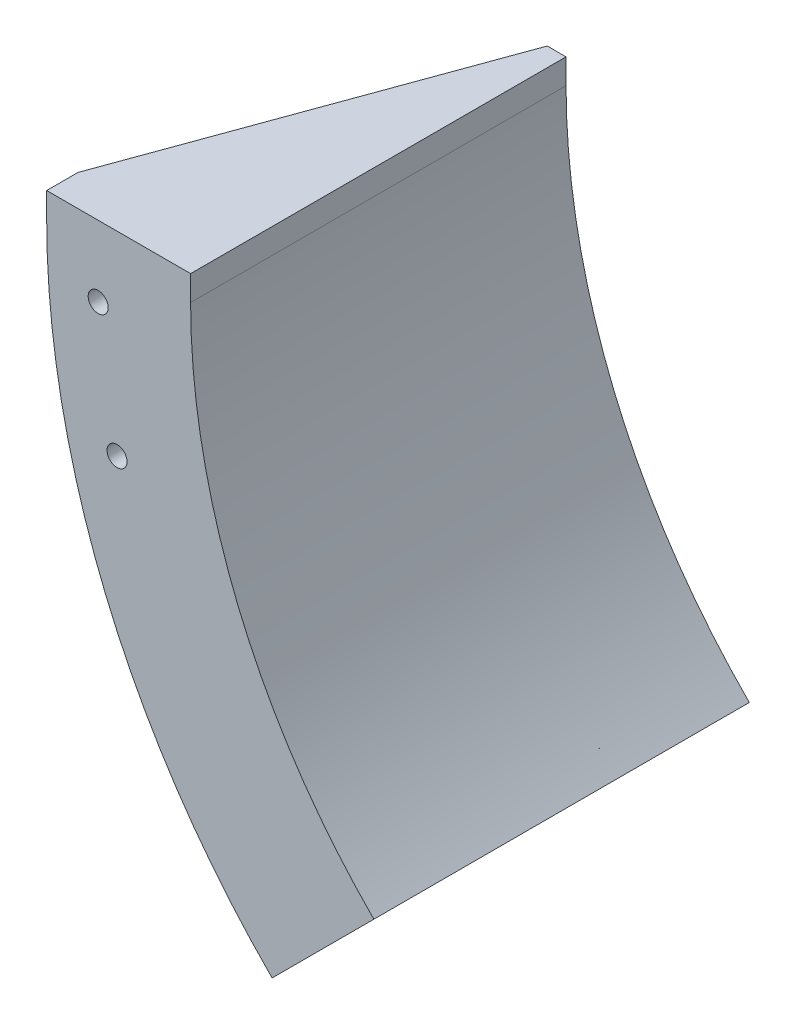
ISO-10303-21;
HEADER;
FILE_DESCRIPTION(('STEP AP214'),'2;1');
FILE_NAME('part.step','',(''),(''),'','','');
FILE_SCHEMA(('AUTOMOTIVE_DESIGN { 1 0 10303 214 1 1 1 1 }'));
ENDSEC;
DATA;
#1=APPLICATION_CONTEXT('core data for automotive mechanical design processes');
#2=APPLICATION_PROTOCOL_DEFINITION('international standard','automotive_design',2000,#1);
#3=PRODUCT_CONTEXT('',#1,'mechanical');
#4=PRODUCT('Part','Part','',(#3));
#5=PRODUCT_RELATED_PRODUCT_CATEGORY('part','',(#4));
#6=PRODUCT_DEFINITION_FORMATION('','',#4);
#7=PRODUCT_DEFINITION_CONTEXT('part definition',#1,'design');
#8=PRODUCT_DEFINITION('design','',#6,#7);
#9=PRODUCT_DEFINITION_SHAPE('','',#8);
#10=(LENGTH_UNIT() NAMED_UNIT(*) SI_UNIT(.MILLI.,.METRE.));
#11=(NAMED_UNIT(*) PLANE_ANGLE_UNIT() SI_UNIT($,.RADIAN.));
#12=(NAMED_UNIT(*) SI_UNIT($,.STERADIAN.) SOLID_ANGLE_UNIT());
#13=UNCERTAINTY_MEASURE_WITH_UNIT(LENGTH_MEASURE(1.E-05),#10,'distance_accuracy_value','');
#14=(GEOMETRIC_REPRESENTATION_CONTEXT(3) GLOBAL_UNCERTAINTY_ASSIGNED_CONTEXT((#13)) GLOBAL_UNIT_ASSIGNED_CONTEXT((#10,
#11,#12)) REPRESENTATION_CONTEXT('',''));
#15=CARTESIAN_POINT('',(0.,0.,0.));
#16=DIRECTION('',(0.,0.,1.));
#17=DIRECTION('',(1.,0.,0.));
#18=AXIS2_PLACEMENT_3D('',#15,#16,#17);
#19=CARTESIAN_POINT('',(-75.6604255869606,-70.0035713374682,0.));
#20=DIRECTION('',(-0.664534302663195,-0.664534302663195,-0.341743063086704));
#21=DIRECTION('',(0.707106781186548,-0.707106781186547,0.));
#22=AXIS2_PLACEMENT_3D('',#19,#20,#21);
#23=PLANE('',#22);
#24=DIRECTION('',(0.241648837332071,0.241648837332071,-0.939793423488437));
#25=VECTOR('',#24,1.);
#26=CARTESIAN_POINT('',(-72.8319984622144,-72.8319984622144,0.));
#27=LINE('',#26,#25);
#28=CARTESIAN_POINT('',(-86.9741340859453,-86.9741340859454,55.));
#29=VERTEX_POINT('',#28);
#30=CARTESIAN_POINT('',(-72.8319984622144,-72.8319984622144,0.));
#31=VERTEX_POINT('',#30);
#32=EDGE_CURVE('E107',#29,#31,#27,.T.);
#33=ORIENTED_EDGE('',*,*,#32,.F.);
#34=DIRECTION('',(0.707106781186548,-0.707106781186547,0.));
#35=VECTOR('',#34,1.);
#36=CARTESIAN_POINT('',(-89.8025612106915,-84.1457069611992,55.));
#37=LINE('',#36,#35);
#38=CARTESIAN_POINT('',(-89.8025612106915,-84.1457069611992,55.));
#39=VERTEX_POINT('',#38);
#40=EDGE_CURVE('E12',#39,#29,#37,.T.);
#41=ORIENTED_EDGE('',*,*,#40,.F.);
#42=DIRECTION('',(0.241648837332071,0.241648837332071,-0.939793423488437));
#43=VECTOR('',#42,1.);
#44=CARTESIAN_POINT('',(-75.6604255869606,-70.0035713374682,0.));
#45=LINE('',#44,#43);
#46=CARTESIAN_POINT('',(-75.6604255869606,-70.0035713374682,0.));
#47=VERTEX_POINT('',#46);
#48=EDGE_CURVE('E102',#39,#47,#45,.T.);
#49=ORIENTED_EDGE('',*,*,#48,.T.);
#50=DIRECTION('',(0.707106781186548,-0.707106781186547,0.));
#51=VECTOR('',#50,1.);
#52=CARTESIAN_POINT('',(-75.6604255869606,-70.0035713374682,0.));
#53=LINE('',#52,#51);
#54=EDGE_CURVE('E46',#47,#31,#53,.T.);
#55=ORIENTED_EDGE('',*,*,#54,.T.);
#56=EDGE_LOOP('',(#33,#41,#49,#55));
#57=FACE_BOUND('',#56,.T.);
#58=ADVANCED_FACE('F43',(#57),#23,.T.);
#59=CARTESIAN_POINT('',(-89.8025612106915,-84.1457069611992,55.));
#60=DIRECTION('',(0.,0.,1.));
#61=DIRECTION('',(1.,0.,0.));
#62=AXIS2_PLACEMENT_3D('',#59,#60,#61);
#63=PLANE('',#62);
#64=DIRECTION('',(-0.707106781186547,-0.707106781186548,0.));
#65=VECTOR('',#64,1.);
#66=CARTESIAN_POINT('',(-86.9741340859453,-86.9741340859454,55.));
#67=LINE('',#66,#65);
#68=CARTESIAN_POINT('',(-70.7106781186547,-70.7106781186548,55.));
#69=VERTEX_POINT('',#68);
#70=EDGE_CURVE('E74',#69,#29,#67,.T.);
#71=ORIENTED_EDGE('',*,*,#70,.F.);
#72=DIRECTION('',(0.707106781186548,-0.707106781186547,0.));
#73=VECTOR('',#72,1.);
#74=CARTESIAN_POINT('',(-73.5391052434009,-67.8822509939086,55.));
#75=LINE('',#74,#73);
#76=CARTESIAN_POINT('',(-73.5391052434009,-67.8822509939086,55.));
#77=VERTEX_POINT('',#76);
#78=EDGE_CURVE('E52',#77,#69,#75,.T.);
#79=ORIENTED_EDGE('',*,*,#78,.F.);
#80=DIRECTION('',(-0.70710678118655,-0.707106781186545,0.));
#81=VECTOR('',#80,1.);
#82=CARTESIAN_POINT('',(-73.5391052434009,-67.8822509939086,55.));
#83=LINE('',#82,#81);
#84=EDGE_CURVE('E60',#77,#39,#83,.T.);
#85=ORIENTED_EDGE('',*,*,#84,.T.);
#86=ORIENTED_EDGE('',*,*,#40,.T.);
#87=EDGE_LOOP('',(#71,#79,#85,#86));
#88=FACE_BOUND('',#87,.T.);
#89=ADVANCED_FACE('F118',(#88),#63,.T.);
#90=CARTESIAN_POINT('',(-73.5391052434009,-67.8822509939086,0.));
#91=DIRECTION('',(0.707106781186547,0.707106781186548,0.));
#92=DIRECTION('',(-0.707106781186548,0.707106781186547,0.));
#93=AXIS2_PLACEMENT_3D('',#90,#91,#92);
#94=PLANE('',#93);
#95=DIRECTION('',(0.,0.,1.));
#96=VECTOR('',#95,1.);
#97=CARTESIAN_POINT('',(-70.7106781186547,-70.7106781186548,0.));
#98=LINE('',#97,#96);
#99=CARTESIAN_POINT('',(-70.7106781186547,-70.7106781186548,0.));
#100=VERTEX_POINT('',#99);
#101=EDGE_CURVE('E93',#100,#69,#98,.T.);
#102=ORIENTED_EDGE('',*,*,#101,.F.);
#103=DIRECTION('',(0.707106781186548,-0.707106781186547,0.));
#104=VECTOR('',#103,1.);
#105=CARTESIAN_POINT('',(-73.5391052434009,-67.8822509939086,0.));
#106=LINE('',#105,#104);
#107=CARTESIAN_POINT('',(-73.5391052434009,-67.8822509939086,0.));
#108=VERTEX_POINT('',#107);
#109=EDGE_CURVE('E88',#108,#100,#106,.T.);
#110=ORIENTED_EDGE('',*,*,#109,.F.);
#111=DIRECTION('',(0.,0.,1.));
#112=VECTOR('',#111,1.);
#113=CARTESIAN_POINT('',(-73.5391052434009,-67.8822509939086,0.));
#114=LINE('',#113,#112);
#115=EDGE_CURVE('E91',#108,#77,#114,.T.);
#116=ORIENTED_EDGE('',*,*,#115,.T.);
#117=ORIENTED_EDGE('',*,*,#78,.T.);
#118=EDGE_LOOP('',(#102,#110,#116,#117));
#119=FACE_BOUND('',#118,.T.);
#120=ADVANCED_FACE('F90',(#119),#94,.T.);
#121=CARTESIAN_POINT('',(-75.6604255869606,-70.0035713374682,0.));
#122=DIRECTION('',(0.,0.,-1.));
#123=DIRECTION('',(-1.,0.,0.));
#124=AXIS2_PLACEMENT_3D('',#121,#122,#123);
#125=PLANE('',#124);
#126=DIRECTION('',(0.70710678118655,0.707106781186545,0.));
#127=VECTOR('',#126,1.);
#128=CARTESIAN_POINT('',(-72.8319984622144,-72.8319984622144,0.));
#129=LINE('',#128,#127);
#130=EDGE_CURVE('E110',#31,#100,#129,.T.);
#131=ORIENTED_EDGE('',*,*,#130,.F.);
#132=ORIENTED_EDGE('',*,*,#54,.F.);
#133=DIRECTION('',(0.70710678118655,0.707106781186545,0.));
#134=VECTOR('',#133,1.);
#135=CARTESIAN_POINT('',(-75.6604255869606,-70.0035713374682,0.));
#136=LINE('',#135,#134);
#137=EDGE_CURVE('E98',#47,#108,#136,.T.);
#138=ORIENTED_EDGE('',*,*,#137,.T.);
#139=ORIENTED_EDGE('',*,*,#109,.T.);
#140=EDGE_LOOP('',(#131,#132,#138,#139));
#141=FACE_BOUND('',#140,.T.);
#142=ADVANCED_FACE('F101',(#141),#125,.T.);
#143=CARTESIAN_POINT('',(-2.82842712474622,2.82842712474622,0.));
#144=DIRECTION('',(-0.707106781186548,0.707106781186547,0.));
#145=DIRECTION('',(-0.707106781186547,-0.707106781186548,0.));
#146=AXIS2_PLACEMENT_3D('',#143,#144,#145);
#147=PLANE('',#146);
#148=ORIENTED_EDGE('',*,*,#48,.F.);
#149=ORIENTED_EDGE('',*,*,#84,.F.);
#150=ORIENTED_EDGE('',*,*,#115,.F.);
#151=ORIENTED_EDGE('',*,*,#137,.F.);
#152=EDGE_LOOP('',(#148,#149,#150,#151));
#153=FACE_BOUND('',#152,.T.);
#154=ADVANCED_FACE('F97',(#153),#147,.T.);
#155=CARTESIAN_POINT('',(0.,0.,0.));
#156=DIRECTION('',(-0.707106781186548,0.707106781186547,0.));
#157=DIRECTION('',(-0.707106781186547,-0.707106781186548,0.));
#158=AXIS2_PLACEMENT_3D('',#155,#156,#157);
#159=PLANE('',#158);
#160=ORIENTED_EDGE('',*,*,#32,.T.);
#161=ORIENTED_EDGE('',*,*,#130,.T.);
#162=ORIENTED_EDGE('',*,*,#101,.T.);
#163=ORIENTED_EDGE('',*,*,#70,.T.);
#164=EDGE_LOOP('',(#160,#161,#162,#163));
#165=FACE_BOUND('',#164,.T.);
#166=ADVANCED_FACE('F115',(#165),#159,.F.);
#167=CLOSED_SHELL('',(#58,#89,#120,#142,#154,#166));
#168=MANIFOLD_SOLID_BREP('B2',#167);
#169=CARTESIAN_POINT('',(0.,0.,60.));
#170=DIRECTION('',(0.,0.,-1.));
#171=DIRECTION('',(-1.,0.,0.));
#172=AXIS2_PLACEMENT_3D('',#169,#170,#171);
#173=CYLINDRICAL_SURFACE('',#172,103.);
#174=CARTESIAN_POINT('',(0.,0.,55.));
#175=DIRECTION('',(0.,0.,-1.));
#176=DIRECTION('',(1.,0.,0.));
#177=AXIS2_PLACEMENT_3D('',#174,#175,#176);
#178=CIRCLE('',#177,103.);
#179=CARTESIAN_POINT('',(-72.8319984622143,-72.8319984622145,55.));
#180=VERTEX_POINT('',#179);
#181=CARTESIAN_POINT('',(-103.,0.,55.));
#182=VERTEX_POINT('',#181);
#183=EDGE_CURVE('E241',#180,#182,#178,.T.);
#184=ORIENTED_EDGE('',*,*,#183,.T.);
#185=DIRECTION('',(0.,0.,-1.));
#186=VECTOR('',#185,1.);
#187=CARTESIAN_POINT('',(-103.,0.,60.));
#188=LINE('',#187,#186);
#189=CARTESIAN_POINT('',(-103.,0.,0.));
#190=VERTEX_POINT('',#189);
#191=EDGE_CURVE('E179',#182,#190,#188,.T.);
#192=ORIENTED_EDGE('',*,*,#191,.T.);
#193=CARTESIAN_POINT('',(0.,0.,0.));
#194=DIRECTION('',(0.,0.,1.));
#195=DIRECTION('',(1.,0.,0.));
#196=AXIS2_PLACEMENT_3D('',#193,#194,#195);
#197=CIRCLE('',#196,103.);
#198=CARTESIAN_POINT('',(-72.8319984622143,-72.8319984622145,0.));
#199=VERTEX_POINT('',#198);
#200=EDGE_CURVE('E216',#190,#199,#197,.T.);
#201=ORIENTED_EDGE('',*,*,#200,.T.);
#202=DIRECTION('',(0.,0.,-1.));
#203=VECTOR('',#202,1.);
#204=CARTESIAN_POINT('',(-72.8319984622143,-72.8319984622145,60.));
#205=LINE('',#204,#203);
#206=EDGE_CURVE('E204',#180,#199,#205,.T.);
#207=ORIENTED_EDGE('',*,*,#206,.F.);
#208=EDGE_LOOP('',(#184,#192,#201,#207));
#209=FACE_BOUND('',#208,.T.);
#210=ADVANCED_FACE('F170',(#209),#173,.T.);
#211=CARTESIAN_POINT('',(0.,0.,60.));
#212=DIRECTION('',(0.,0.,-1.));
#213=DIRECTION('',(-1.,0.,0.));
#214=AXIS2_PLACEMENT_3D('',#211,#212,#213);
#215=CYLINDRICAL_SURFACE('',#214,100.);
#216=CARTESIAN_POINT('',(0.,0.,0.));
#217=DIRECTION('',(0.,0.,-1.));
#218=DIRECTION('',(1.,0.,0.));
#219=AXIS2_PLACEMENT_3D('',#216,#217,#218);
#220=CIRCLE('',#219,100.);
#221=CARTESIAN_POINT('',(-70.7106781186546,-70.7106781186549,0.));
#222=VERTEX_POINT('',#221);
#223=CARTESIAN_POINT('',(-100.,0.,0.));
#224=VERTEX_POINT('',#223);
#225=EDGE_CURVE('E220',#222,#224,#220,.T.);
#226=ORIENTED_EDGE('',*,*,#225,.T.);
#227=DIRECTION('',(0.,0.,-1.));
#228=VECTOR('',#227,1.);
#229=CARTESIAN_POINT('',(-100.,0.,60.));
#230=LINE('',#229,#228);
#231=CARTESIAN_POINT('',(-100.,0.,60.));
#232=VERTEX_POINT('',#231);
#233=EDGE_CURVE('E41',#232,#224,#230,.T.);
#234=ORIENTED_EDGE('',*,*,#233,.F.);
#235=CARTESIAN_POINT('',(0.,0.,60.));
#236=DIRECTION('',(0.,0.,-1.));
#237=DIRECTION('',(1.,0.,0.));
#238=AXIS2_PLACEMENT_3D('',#235,#236,#237);
#239=CIRCLE('',#238,100.);
#240=CARTESIAN_POINT('',(-70.7106781186546,-70.7106781186549,60.));
#241=VERTEX_POINT('',#240);
#242=EDGE_CURVE('E215',#241,#232,#239,.T.);
#243=ORIENTED_EDGE('',*,*,#242,.F.);
#244=DIRECTION('',(0.,0.,-1.));
#245=VECTOR('',#244,1.);
#246=CARTESIAN_POINT('',(-70.7106781186546,-70.7106781186549,60.));
#247=LINE('',#246,#245);
#248=EDGE_CURVE('E210',#241,#222,#247,.T.);
#249=ORIENTED_EDGE('',*,*,#248,.T.);
#250=EDGE_LOOP('',(#226,#234,#243,#249));
#251=FACE_BOUND('',#250,.T.);
#252=ADVANCED_FACE('F172',(#251),#215,.F.);
#253=CARTESIAN_POINT('',(-70.7106781186546,-70.7106781186549,60.));
#254=DIRECTION('',(-0.707106781186547,0.707106781186547,0.));
#255=DIRECTION('',(-0.707106781186548,-0.707106781186548,0.));
#256=AXIS2_PLACEMENT_3D('',#253,#254,#255);
#257=PLANE('',#256);
#258=DIRECTION('',(0.707106781186547,0.707106781186547,0.));
#259=VECTOR('',#258,1.);
#260=CARTESIAN_POINT('',(-70.7106781186546,-70.7106781186549,0.));
#261=LINE('',#260,#259);
#262=EDGE_CURVE('E207',#199,#222,#261,.T.);
#263=ORIENTED_EDGE('',*,*,#262,.T.);
#264=ORIENTED_EDGE('',*,*,#248,.F.);
#265=DIRECTION('',(0.707106781186547,0.707106781186547,0.));
#266=VECTOR('',#265,1.);
#267=CARTESIAN_POINT('',(-70.7106781186546,-70.7106781186549,60.));
#268=LINE('',#267,#266);
#269=CARTESIAN_POINT('',(-86.9741340859447,-86.9741340859461,60.));
#270=VERTEX_POINT('',#269);
#271=EDGE_CURVE('E187',#270,#241,#268,.T.);
#272=ORIENTED_EDGE('',*,*,#271,.F.);
#273=DIRECTION('',(0.,0.,1.));
#274=VECTOR('',#273,1.);
#275=CARTESIAN_POINT('',(-86.9741340859447,-86.9741340859461,55.));
#276=LINE('',#275,#274);
#277=CARTESIAN_POINT('',(-86.9741340859447,-86.9741340859461,55.));
#278=VERTEX_POINT('',#277);
#279=EDGE_CURVE('E227',#278,#270,#276,.T.);
#280=ORIENTED_EDGE('',*,*,#279,.F.);
#281=DIRECTION('',(0.707106781186517,0.707106781186578,0.));
#282=VECTOR('',#281,1.);
#283=CARTESIAN_POINT('',(-72.8319984622143,-72.8319984622145,55.));
#284=LINE('',#283,#282);
#285=EDGE_CURVE('E289',#278,#180,#284,.T.);
#286=ORIENTED_EDGE('',*,*,#285,.T.);
#287=ORIENTED_EDGE('',*,*,#206,.T.);
#288=EDGE_LOOP('',(#263,#264,#272,#280,#286,#287));
#289=FACE_BOUND('',#288,.T.);
#290=ADVANCED_FACE('F209',(#289),#257,.F.);
#291=CARTESIAN_POINT('',(0.,0.,60.));
#292=DIRECTION('',(0.,0.,1.));
#293=DIRECTION('',(1.,0.,0.));
#294=AXIS2_PLACEMENT_3D('',#291,#292,#293);
#295=PLANE('',#294);
#296=CARTESIAN_POINT('',(-111.754632886143,-27.1275142334008,60.));
#297=DIRECTION('',(0.,0.,-1.));
#298=DIRECTION('',(-1.,0.,0.));
#299=AXIS2_PLACEMENT_3D('',#296,#297,#298);
#300=CIRCLE('',#299,1.6);
#301=CARTESIAN_POINT('',(-113.354632886143,-27.1275142334008,60.));
#302=VERTEX_POINT('',#301);
#303=EDGE_CURVE('E275',#302,#302,#300,.T.);
#304=ORIENTED_EDGE('',*,*,#303,.T.);
#305=EDGE_LOOP('',(#304));
#306=FACE_BOUND('',#305,.T.);
#307=CARTESIAN_POINT('',(-114.767472312571,-7.30939799048739,60.));
#308=DIRECTION('',(0.,0.,-1.));
#309=DIRECTION('',(-1.,0.,0.));
#310=AXIS2_PLACEMENT_3D('',#307,#308,#309);
#311=CIRCLE('',#310,1.60000000000002);
#312=CARTESIAN_POINT('',(-116.367472312571,-7.30939799048739,60.));
#313=VERTEX_POINT('',#312);
#314=EDGE_CURVE('E269',#313,#313,#311,.T.);
#315=ORIENTED_EDGE('',*,*,#314,.T.);
#316=EDGE_LOOP('',(#315));
#317=FACE_BOUND('',#316,.T.);
#318=ORIENTED_EDGE('',*,*,#242,.T.);
#319=DIRECTION('',(0.,-1.,0.));
#320=VECTOR('',#319,1.);
#321=CARTESIAN_POINT('',(-100.,4.,60.));
#322=LINE('',#321,#320);
#323=CARTESIAN_POINT('',(-100.,4.,60.));
#324=VERTEX_POINT('',#323);
#325=EDGE_CURVE('E298',#324,#232,#322,.T.);
#326=ORIENTED_EDGE('',*,*,#325,.F.);
#327=DIRECTION('',(1.,0.,0.));
#328=VECTOR('',#327,1.);
#329=CARTESIAN_POINT('',(-123.,4.,60.));
#330=LINE('',#329,#328);
#331=CARTESIAN_POINT('',(-123.,4.,60.));
#332=VERTEX_POINT('',#331);
#333=EDGE_CURVE('E309',#332,#324,#330,.T.);
#334=ORIENTED_EDGE('',*,*,#333,.F.);
#335=DIRECTION('',(0.,-1.,0.));
#336=VECTOR('',#335,1.);
#337=CARTESIAN_POINT('',(-123.,4.,60.));
#338=LINE('',#337,#336);
#339=CARTESIAN_POINT('',(-123.,0.,60.));
#340=VERTEX_POINT('',#339);
#341=EDGE_CURVE('E271',#332,#340,#338,.T.);
#342=ORIENTED_EDGE('',*,*,#341,.T.);
#343=CARTESIAN_POINT('',(0.,0.,60.));
#344=DIRECTION('',(0.,0.,1.));
#345=DIRECTION('',(1.,0.,0.));
#346=AXIS2_PLACEMENT_3D('',#343,#344,#345);
#347=CIRCLE('',#346,123.);
#348=EDGE_CURVE('E278',#340,#270,#347,.T.);
#349=ORIENTED_EDGE('',*,*,#348,.T.);
#350=ORIENTED_EDGE('',*,*,#271,.T.);
#351=EDGE_LOOP('',(#318,#326,#334,#342,#349,#350));
#352=FACE_BOUND('',#351,.T.);
#353=ADVANCED_FACE('F294',(#306,#317,#352),#295,.T.);
#354=CARTESIAN_POINT('',(0.,0.,0.));
#355=DIRECTION('',(0.,0.,1.));
#356=DIRECTION('',(1.,0.,0.));
#357=AXIS2_PLACEMENT_3D('',#354,#355,#356);
#358=PLANE('',#357);
#359=ORIENTED_EDGE('',*,*,#225,.F.);
#360=ORIENTED_EDGE('',*,*,#262,.F.);
#361=ORIENTED_EDGE('',*,*,#200,.F.);
#362=DIRECTION('',(0.,-1.,0.));
#363=VECTOR('',#362,1.);
#364=CARTESIAN_POINT('',(-103.,4.,0.));
#365=LINE('',#364,#363);
#366=CARTESIAN_POINT('',(-103.,4.,0.));
#367=VERTEX_POINT('',#366);
#368=EDGE_CURVE('E248',#367,#190,#365,.T.);
#369=ORIENTED_EDGE('',*,*,#368,.F.);
#370=DIRECTION('',(-1.,0.,0.));
#371=VECTOR('',#370,1.);
#372=CARTESIAN_POINT('',(-100.,4.,0.));
#373=LINE('',#372,#371);
#374=CARTESIAN_POINT('',(-100.,4.,0.));
#375=VERTEX_POINT('',#374);
#376=EDGE_CURVE('E258',#375,#367,#373,.T.);
#377=ORIENTED_EDGE('',*,*,#376,.F.);
#378=DIRECTION('',(0.,-1.,0.));
#379=VECTOR('',#378,1.);
#380=CARTESIAN_POINT('',(-100.,4.,0.));
#381=LINE('',#380,#379);
#382=EDGE_CURVE('E226',#375,#224,#381,.T.);
#383=ORIENTED_EDGE('',*,*,#382,.T.);
#384=EDGE_LOOP('',(#359,#360,#361,#369,#377,#383));
#385=FACE_BOUND('',#384,.T.);
#386=ADVANCED_FACE('F223',(#385),#358,.F.);
#387=CARTESIAN_POINT('',(0.,0.,55.));
#388=DIRECTION('',(0.,0.,1.));
#389=DIRECTION('',(1.,0.,0.));
#390=AXIS2_PLACEMENT_3D('',#387,#388,#389);
#391=CYLINDRICAL_SURFACE('',#390,123.);
#392=ORIENTED_EDGE('',*,*,#348,.F.);
#393=DIRECTION('',(0.,0.,1.));
#394=VECTOR('',#393,1.);
#395=CARTESIAN_POINT('',(-123.,0.,55.));
#396=LINE('',#395,#394);
#397=CARTESIAN_POINT('',(-123.,0.,55.));
#398=VERTEX_POINT('',#397);
#399=EDGE_CURVE('E231',#398,#340,#396,.T.);
#400=ORIENTED_EDGE('',*,*,#399,.F.);
#401=CARTESIAN_POINT('',(0.,0.,55.));
#402=DIRECTION('',(0.,0.,1.));
#403=DIRECTION('',(1.,0.,0.));
#404=AXIS2_PLACEMENT_3D('',#401,#402,#403);
#405=CIRCLE('',#404,123.);
#406=EDGE_CURVE('E286',#398,#278,#405,.T.);
#407=ORIENTED_EDGE('',*,*,#406,.T.);
#408=ORIENTED_EDGE('',*,*,#279,.T.);
#409=EDGE_LOOP('',(#392,#400,#407,#408));
#410=FACE_BOUND('',#409,.T.);
#411=ADVANCED_FACE('F337',(#410),#391,.T.);
#412=CARTESIAN_POINT('',(0.,0.,55.));
#413=DIRECTION('',(0.,0.,1.));
#414=DIRECTION('',(1.,0.,0.));
#415=AXIS2_PLACEMENT_3D('',#412,#413,#414);
#416=PLANE('',#415);
#417=CARTESIAN_POINT('',(-111.754632886143,-27.1275142334008,55.));
#418=DIRECTION('',(0.,0.,-1.));
#419=DIRECTION('',(-1.,0.,0.));
#420=AXIS2_PLACEMENT_3D('',#417,#418,#419);
#421=CIRCLE('',#420,1.6);
#422=CARTESIAN_POINT('',(-113.354632886143,-27.1275142334008,55.));
#423=VERTEX_POINT('',#422);
#424=EDGE_CURVE('E279',#423,#423,#421,.T.);
#425=ORIENTED_EDGE('',*,*,#424,.F.);
#426=EDGE_LOOP('',(#425));
#427=FACE_BOUND('',#426,.T.);
#428=CARTESIAN_POINT('',(-114.767472312571,-7.30939799048739,55.));
#429=DIRECTION('',(0.,0.,-1.));
#430=DIRECTION('',(-1.,0.,0.));
#431=AXIS2_PLACEMENT_3D('',#428,#429,#430);
#432=CIRCLE('',#431,1.60000000000002);
#433=CARTESIAN_POINT('',(-116.367472312571,-7.30939799048739,55.));
#434=VERTEX_POINT('',#433);
#435=EDGE_CURVE('E265',#434,#434,#432,.T.);
#436=ORIENTED_EDGE('',*,*,#435,.F.);
#437=EDGE_LOOP('',(#436));
#438=FACE_BOUND('',#437,.T.);
#439=ORIENTED_EDGE('',*,*,#183,.F.);
#440=ORIENTED_EDGE('',*,*,#285,.F.);
#441=ORIENTED_EDGE('',*,*,#406,.F.);
#442=DIRECTION('',(-1.,0.,0.));
#443=VECTOR('',#442,1.);
#444=CARTESIAN_POINT('',(-103.,0.,55.));
#445=LINE('',#444,#443);
#446=EDGE_CURVE('E254',#182,#398,#445,.T.);
#447=ORIENTED_EDGE('',*,*,#446,.F.);
#448=EDGE_LOOP('',(#439,#440,#441,#447));
#449=FACE_BOUND('',#448,.T.);
#450=ADVANCED_FACE('F368',(#427,#438,#449),#416,.F.);
#451=CARTESIAN_POINT('',(-114.767472312571,-7.30939799048739,60.));
#452=DIRECTION('',(0.,0.,-1.));
#453=DIRECTION('',(-1.,0.,0.));
#454=AXIS2_PLACEMENT_3D('',#451,#452,#453);
#455=CYLINDRICAL_SURFACE('',#454,1.60000000000002);
#456=ORIENTED_EDGE('',*,*,#314,.F.);
#457=EDGE_LOOP('',(#456));
#458=FACE_BOUND('',#457,.T.);
#459=ORIENTED_EDGE('',*,*,#435,.T.);
#460=EDGE_LOOP('',(#459));
#461=FACE_BOUND('',#460,.T.);
#462=ADVANCED_FACE('F371',(#458,#461),#455,.F.);
#463=CARTESIAN_POINT('',(-111.754632886143,-27.1275142334008,60.));
#464=DIRECTION('',(0.,0.,-1.));
#465=DIRECTION('',(-1.,0.,0.));
#466=AXIS2_PLACEMENT_3D('',#463,#464,#465);
#467=CYLINDRICAL_SURFACE('',#466,1.6);
#468=ORIENTED_EDGE('',*,*,#303,.F.);
#469=EDGE_LOOP('',(#468));
#470=FACE_BOUND('',#469,.T.);
#471=ORIENTED_EDGE('',*,*,#424,.T.);
#472=EDGE_LOOP('',(#471));
#473=FACE_BOUND('',#472,.T.);
#474=ADVANCED_FACE('F352',(#470,#473),#467,.F.);
#475=CARTESIAN_POINT('',(-103.,4.,0.));
#476=DIRECTION('',(0.939793423488437,0.,0.341743063086704));
#477=DIRECTION('',(0.341743063086704,0.,-0.939793423488437));
#478=AXIS2_PLACEMENT_3D('',#475,#476,#477);
#479=PLANE('',#478);
#480=DIRECTION('',(-0.341743063086704,0.,0.939793423488437));
#481=VECTOR('',#480,1.);
#482=CARTESIAN_POINT('',(-103.,0.,0.));
#483=LINE('',#482,#481);
#484=EDGE_CURVE('E250',#190,#398,#483,.T.);
#485=ORIENTED_EDGE('',*,*,#484,.T.);
#486=DIRECTION('',(0.,-1.,0.));
#487=VECTOR('',#486,1.);
#488=CARTESIAN_POINT('',(-123.,4.,55.));
#489=LINE('',#488,#487);
#490=CARTESIAN_POINT('',(-123.,4.,55.));
#491=VERTEX_POINT('',#490);
#492=EDGE_CURVE('E266',#491,#398,#489,.T.);
#493=ORIENTED_EDGE('',*,*,#492,.F.);
#494=DIRECTION('',(-0.341743063086704,0.,0.939793423488437));
#495=VECTOR('',#494,1.);
#496=CARTESIAN_POINT('',(-103.,4.,0.));
#497=LINE('',#496,#495);
#498=EDGE_CURVE('E263',#367,#491,#497,.T.);
#499=ORIENTED_EDGE('',*,*,#498,.F.);
#500=ORIENTED_EDGE('',*,*,#368,.T.);
#501=EDGE_LOOP('',(#485,#493,#499,#500));
#502=FACE_BOUND('',#501,.T.);
#503=ADVANCED_FACE('F261',(#502),#479,.F.);
#504=CARTESIAN_POINT('',(-123.,4.,55.));
#505=DIRECTION('',(1.,0.,0.));
#506=DIRECTION('',(0.,0.,-1.));
#507=AXIS2_PLACEMENT_3D('',#504,#505,#506);
#508=PLANE('',#507);
#509=ORIENTED_EDGE('',*,*,#399,.T.);
#510=ORIENTED_EDGE('',*,*,#341,.F.);
#511=DIRECTION('',(0.,0.,1.));
#512=VECTOR('',#511,1.);
#513=CARTESIAN_POINT('',(-123.,4.,55.));
#514=LINE('',#513,#512);
#515=EDGE_CURVE('E312',#491,#332,#514,.T.);
#516=ORIENTED_EDGE('',*,*,#515,.F.);
#517=ORIENTED_EDGE('',*,*,#492,.T.);
#518=EDGE_LOOP('',(#509,#510,#516,#517));
#519=FACE_BOUND('',#518,.T.);
#520=ADVANCED_FACE('F343',(#519),#508,.F.);
#521=CARTESIAN_POINT('',(-100.,4.,60.));
#522=DIRECTION('',(-1.,0.,0.));
#523=DIRECTION('',(0.,0.,1.));
#524=AXIS2_PLACEMENT_3D('',#521,#522,#523);
#525=PLANE('',#524);
#526=ORIENTED_EDGE('',*,*,#233,.T.);
#527=ORIENTED_EDGE('',*,*,#382,.F.);
#528=DIRECTION('',(0.,0.,-1.));
#529=VECTOR('',#528,1.);
#530=CARTESIAN_POINT('',(-100.,4.,60.));
#531=LINE('',#530,#529);
#532=EDGE_CURVE('E303',#324,#375,#531,.T.);
#533=ORIENTED_EDGE('',*,*,#532,.F.);
#534=ORIENTED_EDGE('',*,*,#325,.T.);
#535=EDGE_LOOP('',(#526,#527,#533,#534));
#536=FACE_BOUND('',#535,.T.);
#537=ADVANCED_FACE('F301',(#536),#525,.F.);
#538=CARTESIAN_POINT('',(0.,4.,0.));
#539=DIRECTION('',(0.,1.,0.));
#540=DIRECTION('',(0.,0.,1.));
#541=AXIS2_PLACEMENT_3D('',#538,#539,#540);
#542=PLANE('',#541);
#543=ORIENTED_EDGE('',*,*,#376,.T.);
#544=ORIENTED_EDGE('',*,*,#498,.T.);
#545=ORIENTED_EDGE('',*,*,#515,.T.);
#546=ORIENTED_EDGE('',*,*,#333,.T.);
#547=ORIENTED_EDGE('',*,*,#532,.T.);
#548=EDGE_LOOP('',(#543,#544,#545,#546,#547));
#549=FACE_BOUND('',#548,.T.);
#550=ADVANCED_FACE('F317',(#549),#542,.T.);
#551=CARTESIAN_POINT('',(0.,0.,0.));
#552=DIRECTION('',(0.,1.,0.));
#553=DIRECTION('',(0.,0.,1.));
#554=AXIS2_PLACEMENT_3D('',#551,#552,#553);
#555=PLANE('',#554);
#556=ORIENTED_EDGE('',*,*,#191,.F.);
#557=ORIENTED_EDGE('',*,*,#446,.T.);
#558=ORIENTED_EDGE('',*,*,#484,.F.);
#559=EDGE_LOOP('',(#556,#557,#558));
#560=FACE_BOUND('',#559,.T.);
#561=ADVANCED_FACE('F251',(#560),#555,.F.);
#562=CLOSED_SHELL('',(#210,#252,#290,#353,#386,#411,#450,#462,#474,#503,#520,#537,#550,#561));
#563=MANIFOLD_SOLID_BREP('B6',#562);
#564=ADVANCED_BREP_SHAPE_REPRESENTATION('',(#18,#168,#563),#14);
#565=SHAPE_DEFINITION_REPRESENTATION(#9,#564);
ENDSEC;
END-ISO-10303-21;
